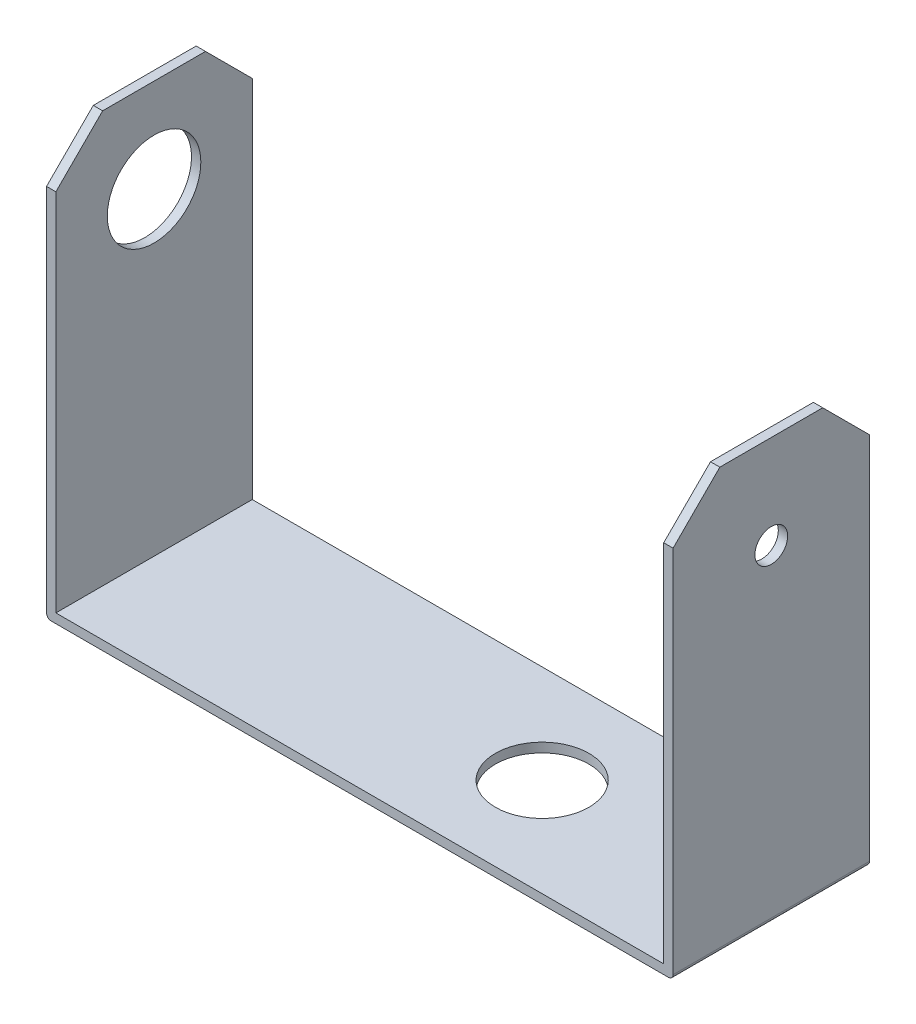
ISO-10303-21;
HEADER;
FILE_DESCRIPTION(('STEP AP214'),'2;1');
FILE_NAME('part.step','',(''),(''),'','','');
FILE_SCHEMA(('AUTOMOTIVE_DESIGN { 1 0 10303 214 1 1 1 1 }'));
ENDSEC;
DATA;
#1=APPLICATION_CONTEXT('core data for automotive mechanical design processes');
#2=APPLICATION_PROTOCOL_DEFINITION('international standard','automotive_design',2000,#1);
#3=PRODUCT_CONTEXT('',#1,'mechanical');
#4=PRODUCT('Part','Part','',(#3));
#5=PRODUCT_RELATED_PRODUCT_CATEGORY('part','',(#4));
#6=PRODUCT_DEFINITION_FORMATION('','',#4);
#7=PRODUCT_DEFINITION_CONTEXT('part definition',#1,'design');
#8=PRODUCT_DEFINITION('design','',#6,#7);
#9=PRODUCT_DEFINITION_SHAPE('','',#8);
#10=(LENGTH_UNIT() NAMED_UNIT(*) SI_UNIT(.MILLI.,.METRE.));
#11=(NAMED_UNIT(*) PLANE_ANGLE_UNIT() SI_UNIT($,.RADIAN.));
#12=(NAMED_UNIT(*) SI_UNIT($,.STERADIAN.) SOLID_ANGLE_UNIT());
#13=UNCERTAINTY_MEASURE_WITH_UNIT(LENGTH_MEASURE(1.E-05),#10,'distance_accuracy_value','');
#14=(GEOMETRIC_REPRESENTATION_CONTEXT(3) GLOBAL_UNCERTAINTY_ASSIGNED_CONTEXT((#13)) GLOBAL_UNIT_ASSIGNED_CONTEXT((#10,
#11,#12)) REPRESENTATION_CONTEXT('',''));
#15=CARTESIAN_POINT('',(0.,0.,0.));
#16=DIRECTION('',(0.,0.,1.));
#17=DIRECTION('',(1.,0.,0.));
#18=AXIS2_PLACEMENT_3D('',#15,#16,#17);
#19=CARTESIAN_POINT('',(0.,45.,-21.));
#20=DIRECTION('',(-1.,0.,0.));
#21=DIRECTION('',(0.,0.,1.));
#22=AXIS2_PLACEMENT_3D('',#19,#20,#21);
#23=PLANE('',#22);
#24=DIRECTION('',(0.,-1.,0.));
#25=VECTOR('',#24,1.);
#26=CARTESIAN_POINT('',(0.,45.,-21.));
#27=LINE('',#26,#25);
#28=CARTESIAN_POINT('',(0.,40.,-21.));
#29=VERTEX_POINT('',#28);
#30=CARTESIAN_POINT('',(0.,0.500000000000014,-21.));
#31=VERTEX_POINT('',#30);
#32=EDGE_CURVE('E194',#29,#31,#27,.T.);
#33=ORIENTED_EDGE('',*,*,#32,.F.);
#34=DIRECTION('',(0.,-0.707106781186547,-0.707106781186548));
#35=VECTOR('',#34,1.);
#36=CARTESIAN_POINT('',(0.,45.,-16.));
#37=LINE('',#36,#35);
#38=CARTESIAN_POINT('',(0.,45.,-16.));
#39=VERTEX_POINT('',#38);
#40=EDGE_CURVE('E11',#29,#39,#37,.F.);
#41=ORIENTED_EDGE('',*,*,#40,.T.);
#42=DIRECTION('',(0.,0.,-1.));
#43=VECTOR('',#42,1.);
#44=CARTESIAN_POINT('',(0.,45.,-21.));
#45=LINE('',#44,#43);
#46=CARTESIAN_POINT('',(0.,45.,-5.00000000000003));
#47=VERTEX_POINT('',#46);
#48=EDGE_CURVE('E178',#47,#39,#45,.T.);
#49=ORIENTED_EDGE('',*,*,#48,.F.);
#50=DIRECTION('',(0.,0.707106781186547,-0.707106781186548));
#51=VECTOR('',#50,1.);
#52=CARTESIAN_POINT('',(0.,45.,-5.00000000000003));
#53=LINE('',#52,#51);
#54=CARTESIAN_POINT('',(0.,40.,0.));
#55=VERTEX_POINT('',#54);
#56=EDGE_CURVE('E43',#47,#55,#53,.F.);
#57=ORIENTED_EDGE('',*,*,#56,.T.);
#58=DIRECTION('',(0.,-1.,0.));
#59=VECTOR('',#58,1.);
#60=CARTESIAN_POINT('',(0.,45.,0.));
#61=LINE('',#60,#59);
#62=CARTESIAN_POINT('',(0.,0.500000000000014,0.));
#63=VERTEX_POINT('',#62);
#64=EDGE_CURVE('E184',#55,#63,#61,.T.);
#65=ORIENTED_EDGE('',*,*,#64,.T.);
#66=DIRECTION('',(0.,0.,-1.));
#67=VECTOR('',#66,1.);
#68=CARTESIAN_POINT('',(0.,0.5,-21.));
#69=LINE('',#68,#67);
#70=EDGE_CURVE('E196',#63,#31,#69,.T.);
#71=ORIENTED_EDGE('',*,*,#70,.T.);
#72=EDGE_LOOP('',(#33,#41,#49,#57,#65,#71));
#73=FACE_BOUND('',#72,.T.);
#74=CARTESIAN_POINT('',(0.,35.,-10.5));
#75=DIRECTION('',(1.,0.,0.));
#76=DIRECTION('',(0.,0.,-1.));
#77=AXIS2_PLACEMENT_3D('',#74,#75,#76);
#78=CIRCLE('',#77,1.75);
#79=CARTESIAN_POINT('',(0.,35.,-12.25));
#80=VERTEX_POINT('',#79);
#81=EDGE_CURVE('E367',#80,#80,#78,.T.);
#82=ORIENTED_EDGE('',*,*,#81,.F.);
#83=EDGE_LOOP('',(#82));
#84=FACE_BOUND('',#83,.T.);
#85=ADVANCED_FACE('F35',(#73,#84),#23,.F.);
#86=CARTESIAN_POINT('',(0.,45.,0.));
#87=DIRECTION('',(0.,-1.,0.));
#88=DIRECTION('',(0.,0.,-1.));
#89=AXIS2_PLACEMENT_3D('',#86,#87,#88);
#90=PLANE('',#89);
#91=ORIENTED_EDGE('',*,*,#48,.T.);
#92=DIRECTION('',(-1.,0.,0.));
#93=VECTOR('',#92,1.);
#94=CARTESIAN_POINT('',(0.,45.,-16.));
#95=LINE('',#94,#93);
#96=CARTESIAN_POINT('',(-1.,45.,-16.));
#97=VERTEX_POINT('',#96);
#98=EDGE_CURVE('E240',#39,#97,#95,.T.);
#99=ORIENTED_EDGE('',*,*,#98,.T.);
#100=DIRECTION('',(0.,0.,-1.));
#101=VECTOR('',#100,1.);
#102=CARTESIAN_POINT('',(-1.,45.,0.));
#103=LINE('',#102,#101);
#104=CARTESIAN_POINT('',(-1.,45.,-5.00000000000003));
#105=VERTEX_POINT('',#104);
#106=EDGE_CURVE('E173',#105,#97,#103,.T.);
#107=ORIENTED_EDGE('',*,*,#106,.F.);
#108=DIRECTION('',(1.,0.,0.));
#109=VECTOR('',#108,1.);
#110=CARTESIAN_POINT('',(0.,45.,-5.00000000000003));
#111=LINE('',#110,#109);
#112=EDGE_CURVE('E238',#105,#47,#111,.T.);
#113=ORIENTED_EDGE('',*,*,#112,.T.);
#114=EDGE_LOOP('',(#91,#99,#107,#113));
#115=FACE_BOUND('',#114,.T.);
#116=ADVANCED_FACE('F255',(#115),#90,.F.);
#117=DIRECTION('',(0.,0.,1.));
#118=VECTOR('',#117,1.);
#119=CARTESIAN_POINT('',(-66.,45.,0.));
#120=LINE('',#119,#118);
#121=CARTESIAN_POINT('',(-66.,45.,-16.));
#122=VERTEX_POINT('',#121);
#123=CARTESIAN_POINT('',(-66.,45.,-5.00000000000003));
#124=VERTEX_POINT('',#123);
#125=EDGE_CURVE('E169',#122,#124,#120,.T.);
#126=ORIENTED_EDGE('',*,*,#125,.F.);
#127=DIRECTION('',(-1.,0.,0.));
#128=VECTOR('',#127,1.);
#129=CARTESIAN_POINT('',(0.,45.,-16.));
#130=LINE('',#129,#128);
#131=CARTESIAN_POINT('',(-67.,45.,-16.));
#132=VERTEX_POINT('',#131);
#133=EDGE_CURVE('E219',#122,#132,#130,.T.);
#134=ORIENTED_EDGE('',*,*,#133,.T.);
#135=DIRECTION('',(0.,0.,1.));
#136=VECTOR('',#135,1.);
#137=CARTESIAN_POINT('',(-67.,45.,0.));
#138=LINE('',#137,#136);
#139=CARTESIAN_POINT('',(-67.,45.,-5.00000000000003));
#140=VERTEX_POINT('',#139);
#141=EDGE_CURVE('E180',#132,#140,#138,.T.);
#142=ORIENTED_EDGE('',*,*,#141,.T.);
#143=DIRECTION('',(1.,0.,0.));
#144=VECTOR('',#143,1.);
#145=CARTESIAN_POINT('',(0.,45.,-5.00000000000003));
#146=LINE('',#145,#144);
#147=EDGE_CURVE('E216',#140,#124,#146,.T.);
#148=ORIENTED_EDGE('',*,*,#147,.T.);
#149=EDGE_LOOP('',(#126,#134,#142,#148));
#150=FACE_BOUND('',#149,.T.);
#151=ADVANCED_FACE('F283',(#150),#90,.F.);
#152=CARTESIAN_POINT('',(-67.,45.,-21.));
#153=DIRECTION('',(0.,0.,1.));
#154=DIRECTION('',(1.,0.,0.));
#155=AXIS2_PLACEMENT_3D('',#152,#153,#154);
#156=PLANE('',#155);
#157=DIRECTION('',(0.,-1.,0.));
#158=VECTOR('',#157,1.);
#159=CARTESIAN_POINT('',(-67.,45.,-21.));
#160=LINE('',#159,#158);
#161=CARTESIAN_POINT('',(-67.,40.,-21.));
#162=VERTEX_POINT('',#161);
#163=CARTESIAN_POINT('',(-67.,0.500000000000014,-21.));
#164=VERTEX_POINT('',#163);
#165=EDGE_CURVE('E192',#162,#164,#160,.T.);
#166=ORIENTED_EDGE('',*,*,#165,.F.);
#167=DIRECTION('',(1.,0.,0.));
#168=VECTOR('',#167,1.);
#169=CARTESIAN_POINT('',(-67.,40.,-21.));
#170=LINE('',#169,#168);
#171=CARTESIAN_POINT('',(-66.,40.,-21.));
#172=VERTEX_POINT('',#171);
#173=EDGE_CURVE('E228',#162,#172,#170,.T.);
#174=ORIENTED_EDGE('',*,*,#173,.T.);
#175=DIRECTION('',(0.,-1.,0.));
#176=VECTOR('',#175,1.);
#177=CARTESIAN_POINT('',(-66.,45.,-21.));
#178=LINE('',#177,#176);
#179=CARTESIAN_POINT('',(-66.,1.,-21.));
#180=VERTEX_POINT('',#179);
#181=EDGE_CURVE('E147',#172,#180,#178,.T.);
#182=ORIENTED_EDGE('',*,*,#181,.T.);
#183=DIRECTION('',(-1.,0.,0.));
#184=VECTOR('',#183,1.);
#185=CARTESIAN_POINT('',(0.,1.,-21.));
#186=LINE('',#185,#184);
#187=CARTESIAN_POINT('',(-1.,1.,-21.));
#188=VERTEX_POINT('',#187);
#189=EDGE_CURVE('E154',#188,#180,#186,.T.);
#190=ORIENTED_EDGE('',*,*,#189,.F.);
#191=DIRECTION('',(0.,-1.,0.));
#192=VECTOR('',#191,1.);
#193=CARTESIAN_POINT('',(-1.00000000000001,45.,-21.));
#194=LINE('',#193,#192);
#195=CARTESIAN_POINT('',(-1.00000000000001,40.,-21.));
#196=VERTEX_POINT('',#195);
#197=EDGE_CURVE('E136',#196,#188,#194,.T.);
#198=ORIENTED_EDGE('',*,*,#197,.F.);
#199=DIRECTION('',(1.,0.,0.));
#200=VECTOR('',#199,1.);
#201=CARTESIAN_POINT('',(-67.,40.,-21.));
#202=LINE('',#201,#200);
#203=EDGE_CURVE('E226',#196,#29,#202,.T.);
#204=ORIENTED_EDGE('',*,*,#203,.T.);
#205=ORIENTED_EDGE('',*,*,#32,.T.);
#206=CARTESIAN_POINT('',(-0.5,0.5,-21.));
#207=DIRECTION('',(0.,0.,1.));
#208=DIRECTION('',(1.,0.,0.));
#209=AXIS2_PLACEMENT_3D('',#206,#207,#208);
#210=CIRCLE('',#209,0.5);
#211=CARTESIAN_POINT('',(-0.5,0.,-21.));
#212=VERTEX_POINT('',#211);
#213=EDGE_CURVE('E202',#31,#212,#210,.F.);
#214=ORIENTED_EDGE('',*,*,#213,.T.);
#215=DIRECTION('',(-1.,0.,0.));
#216=VECTOR('',#215,1.);
#217=CARTESIAN_POINT('',(-67.,0.,-21.));
#218=LINE('',#217,#216);
#219=CARTESIAN_POINT('',(-66.5,0.,-21.));
#220=VERTEX_POINT('',#219);
#221=EDGE_CURVE('E146',#212,#220,#218,.T.);
#222=ORIENTED_EDGE('',*,*,#221,.T.);
#223=CARTESIAN_POINT('',(-66.5,0.5,-21.));
#224=DIRECTION('',(0.,0.,1.));
#225=DIRECTION('',(1.,0.,0.));
#226=AXIS2_PLACEMENT_3D('',#223,#224,#225);
#227=CIRCLE('',#226,0.5);
#228=EDGE_CURVE('E199',#220,#164,#227,.F.);
#229=ORIENTED_EDGE('',*,*,#228,.T.);
#230=EDGE_LOOP('',(#166,#174,#182,#190,#198,#204,#205,#214,#222,#229));
#231=FACE_BOUND('',#230,.T.);
#232=ADVANCED_FACE('F161',(#231),#156,.F.);
#233=CARTESIAN_POINT('',(-67.,45.,0.));
#234=DIRECTION('',(1.,0.,0.));
#235=DIRECTION('',(0.,0.,-1.));
#236=AXIS2_PLACEMENT_3D('',#233,#234,#235);
#237=PLANE('',#236);
#238=CARTESIAN_POINT('',(-67.,35.,-10.5));
#239=DIRECTION('',(-1.,0.,0.));
#240=DIRECTION('',(0.,0.,1.));
#241=AXIS2_PLACEMENT_3D('',#238,#239,#240);
#242=CIRCLE('',#241,4.99999999999999);
#243=CARTESIAN_POINT('',(-67.,35.,-5.50000000000001));
#244=VERTEX_POINT('',#243);
#245=EDGE_CURVE('E354',#244,#244,#242,.T.);
#246=ORIENTED_EDGE('',*,*,#245,.F.);
#247=EDGE_LOOP('',(#246));
#248=FACE_BOUND('',#247,.T.);
#249=ORIENTED_EDGE('',*,*,#141,.F.);
#250=DIRECTION('',(0.,0.707106781186547,0.707106781186548));
#251=VECTOR('',#250,1.);
#252=CARTESIAN_POINT('',(-67.,45.,-16.));
#253=LINE('',#252,#251);
#254=EDGE_CURVE('E224',#132,#162,#253,.F.);
#255=ORIENTED_EDGE('',*,*,#254,.T.);
#256=ORIENTED_EDGE('',*,*,#165,.T.);
#257=DIRECTION('',(0.,0.,1.));
#258=VECTOR('',#257,1.);
#259=CARTESIAN_POINT('',(-67.,0.5,0.));
#260=LINE('',#259,#258);
#261=CARTESIAN_POINT('',(-67.,0.500000000000014,0.));
#262=VERTEX_POINT('',#261);
#263=EDGE_CURVE('E213',#164,#262,#260,.T.);
#264=ORIENTED_EDGE('',*,*,#263,.T.);
#265=DIRECTION('',(0.,-1.,0.));
#266=VECTOR('',#265,1.);
#267=CARTESIAN_POINT('',(-67.,45.,0.));
#268=LINE('',#267,#266);
#269=CARTESIAN_POINT('',(-67.,40.,0.));
#270=VERTEX_POINT('',#269);
#271=EDGE_CURVE('E190',#270,#262,#268,.T.);
#272=ORIENTED_EDGE('',*,*,#271,.F.);
#273=DIRECTION('',(0.,-0.707106781186547,0.707106781186548));
#274=VECTOR('',#273,1.);
#275=CARTESIAN_POINT('',(-67.,45.,-5.00000000000003));
#276=LINE('',#275,#274);
#277=EDGE_CURVE('E222',#270,#140,#276,.F.);
#278=ORIENTED_EDGE('',*,*,#277,.T.);
#279=EDGE_LOOP('',(#249,#255,#256,#264,#272,#278));
#280=FACE_BOUND('',#279,.T.);
#281=ADVANCED_FACE('F291',(#248,#280),#237,.F.);
#282=CARTESIAN_POINT('',(0.,45.,0.));
#283=DIRECTION('',(0.,0.,-1.));
#284=DIRECTION('',(-1.,0.,0.));
#285=AXIS2_PLACEMENT_3D('',#282,#283,#284);
#286=PLANE('',#285);
#287=DIRECTION('',(0.,-1.,0.));
#288=VECTOR('',#287,1.);
#289=CARTESIAN_POINT('',(-66.,45.,0.));
#290=LINE('',#289,#288);
#291=CARTESIAN_POINT('',(-66.,40.,0.));
#292=VERTEX_POINT('',#291);
#293=CARTESIAN_POINT('',(-66.,1.,0.));
#294=VERTEX_POINT('',#293);
#295=EDGE_CURVE('E168',#292,#294,#290,.T.);
#296=ORIENTED_EDGE('',*,*,#295,.F.);
#297=DIRECTION('',(-1.,0.,0.));
#298=VECTOR('',#297,1.);
#299=CARTESIAN_POINT('',(0.,40.,0.));
#300=LINE('',#299,#298);
#301=EDGE_CURVE('E236',#292,#270,#300,.T.);
#302=ORIENTED_EDGE('',*,*,#301,.T.);
#303=ORIENTED_EDGE('',*,*,#271,.T.);
#304=CARTESIAN_POINT('',(-66.5,0.5,0.));
#305=DIRECTION('',(0.,0.,-1.));
#306=DIRECTION('',(-1.,0.,0.));
#307=AXIS2_PLACEMENT_3D('',#304,#305,#306);
#308=CIRCLE('',#307,0.5);
#309=CARTESIAN_POINT('',(-66.5,0.,0.));
#310=VERTEX_POINT('',#309);
#311=EDGE_CURVE('E208',#262,#310,#308,.F.);
#312=ORIENTED_EDGE('',*,*,#311,.T.);
#313=DIRECTION('',(1.,0.,0.));
#314=VECTOR('',#313,1.);
#315=CARTESIAN_POINT('',(0.,0.,0.));
#316=LINE('',#315,#314);
#317=CARTESIAN_POINT('',(-0.5,0.,0.));
#318=VERTEX_POINT('',#317);
#319=EDGE_CURVE('E181',#310,#318,#316,.T.);
#320=ORIENTED_EDGE('',*,*,#319,.T.);
#321=CARTESIAN_POINT('',(-0.5,0.5,0.));
#322=DIRECTION('',(0.,0.,-1.));
#323=DIRECTION('',(-1.,0.,0.));
#324=AXIS2_PLACEMENT_3D('',#321,#322,#323);
#325=CIRCLE('',#324,0.5);
#326=EDGE_CURVE('E210',#318,#63,#325,.F.);
#327=ORIENTED_EDGE('',*,*,#326,.T.);
#328=ORIENTED_EDGE('',*,*,#64,.F.);
#329=DIRECTION('',(-1.,0.,0.));
#330=VECTOR('',#329,1.);
#331=CARTESIAN_POINT('',(0.,40.,0.));
#332=LINE('',#331,#330);
#333=CARTESIAN_POINT('',(-1.,40.,0.));
#334=VERTEX_POINT('',#333);
#335=EDGE_CURVE('E234',#55,#334,#332,.T.);
#336=ORIENTED_EDGE('',*,*,#335,.T.);
#337=DIRECTION('',(0.,-1.,0.));
#338=VECTOR('',#337,1.);
#339=CARTESIAN_POINT('',(-1.,45.,0.));
#340=LINE('',#339,#338);
#341=CARTESIAN_POINT('',(-1.,1.,0.));
#342=VERTEX_POINT('',#341);
#343=EDGE_CURVE('E172',#334,#342,#340,.T.);
#344=ORIENTED_EDGE('',*,*,#343,.T.);
#345=DIRECTION('',(1.,0.,0.));
#346=VECTOR('',#345,1.);
#347=CARTESIAN_POINT('',(0.,1.,0.));
#348=LINE('',#347,#346);
#349=EDGE_CURVE('E157',#294,#342,#348,.T.);
#350=ORIENTED_EDGE('',*,*,#349,.F.);
#351=EDGE_LOOP('',(#296,#302,#303,#312,#320,#327,#328,#336,#344,#350));
#352=FACE_BOUND('',#351,.T.);
#353=ADVANCED_FACE('F249',(#352),#286,.F.);
#354=CARTESIAN_POINT('',(0.,0.,0.));
#355=DIRECTION('',(0.,-1.,0.));
#356=DIRECTION('',(0.,0.,-1.));
#357=AXIS2_PLACEMENT_3D('',#354,#355,#356);
#358=PLANE('',#357);
#359=CARTESIAN_POINT('',(-24.5,0.,-10.5));
#360=DIRECTION('',(0.,-1.,0.));
#361=DIRECTION('',(0.,0.,-1.));
#362=AXIS2_PLACEMENT_3D('',#359,#360,#361);
#363=CIRCLE('',#362,4.99999999999999);
#364=CARTESIAN_POINT('',(-24.5,0.,-15.5));
#365=VERTEX_POINT('',#364);
#366=EDGE_CURVE('E352',#365,#365,#363,.T.);
#367=ORIENTED_EDGE('',*,*,#366,.F.);
#368=EDGE_LOOP('',(#367));
#369=FACE_BOUND('',#368,.T.);
#370=ORIENTED_EDGE('',*,*,#221,.F.);
#371=DIRECTION('',(0.,0.,-1.));
#372=VECTOR('',#371,1.);
#373=CARTESIAN_POINT('',(-0.5,0.,0.));
#374=LINE('',#373,#372);
#375=EDGE_CURVE('E206',#212,#318,#374,.F.);
#376=ORIENTED_EDGE('',*,*,#375,.T.);
#377=ORIENTED_EDGE('',*,*,#319,.F.);
#378=DIRECTION('',(0.,0.,1.));
#379=VECTOR('',#378,1.);
#380=CARTESIAN_POINT('',(-66.5,0.,-21.));
#381=LINE('',#380,#379);
#382=EDGE_CURVE('E204',#310,#220,#381,.F.);
#383=ORIENTED_EDGE('',*,*,#382,.T.);
#384=EDGE_LOOP('',(#370,#376,#377,#383));
#385=FACE_BOUND('',#384,.T.);
#386=ADVANCED_FACE('F266',(#369,#385),#358,.T.);
#387=CARTESIAN_POINT('',(-1.,45.,-21.));
#388=DIRECTION('',(-1.,0.,0.));
#389=DIRECTION('',(0.,0.,1.));
#390=AXIS2_PLACEMENT_3D('',#387,#388,#389);
#391=PLANE('',#390);
#392=CARTESIAN_POINT('',(-1.,35.,-10.5));
#393=DIRECTION('',(-1.,0.,0.));
#394=DIRECTION('',(0.,0.,1.));
#395=AXIS2_PLACEMENT_3D('',#392,#393,#394);
#396=CIRCLE('',#395,1.75);
#397=CARTESIAN_POINT('',(-1.,35.,-8.75));
#398=VERTEX_POINT('',#397);
#399=EDGE_CURVE('E359',#398,#398,#396,.T.);
#400=ORIENTED_EDGE('',*,*,#399,.F.);
#401=EDGE_LOOP('',(#400));
#402=FACE_BOUND('',#401,.T.);
#403=ORIENTED_EDGE('',*,*,#106,.T.);
#404=DIRECTION('',(0.,0.707106781186547,0.707106781186548));
#405=VECTOR('',#404,1.);
#406=CARTESIAN_POINT('',(-1.,42.5,-18.5));
#407=LINE('',#406,#405);
#408=EDGE_CURVE('E142',#97,#196,#407,.F.);
#409=ORIENTED_EDGE('',*,*,#408,.T.);
#410=ORIENTED_EDGE('',*,*,#197,.T.);
#411=DIRECTION('',(0.,0.,-1.));
#412=VECTOR('',#411,1.);
#413=CARTESIAN_POINT('',(-1.,1.,0.));
#414=LINE('',#413,#412);
#415=EDGE_CURVE('E141',#342,#188,#414,.T.);
#416=ORIENTED_EDGE('',*,*,#415,.F.);
#417=ORIENTED_EDGE('',*,*,#343,.F.);
#418=DIRECTION('',(0.,-0.707106781186547,0.707106781186548));
#419=VECTOR('',#418,1.);
#420=CARTESIAN_POINT('',(-1.,53.,-13.));
#421=LINE('',#420,#419);
#422=EDGE_CURVE('E243',#334,#105,#421,.F.);
#423=ORIENTED_EDGE('',*,*,#422,.T.);
#424=EDGE_LOOP('',(#403,#409,#410,#416,#417,#423));
#425=FACE_BOUND('',#424,.T.);
#426=ADVANCED_FACE('F139',(#402,#425),#391,.T.);
#427=CARTESIAN_POINT('',(-66.,45.,0.));
#428=DIRECTION('',(1.,0.,0.));
#429=DIRECTION('',(0.,0.,-1.));
#430=AXIS2_PLACEMENT_3D('',#427,#428,#429);
#431=PLANE('',#430);
#432=CARTESIAN_POINT('',(-66.,35.,-10.5));
#433=DIRECTION('',(1.,0.,0.));
#434=DIRECTION('',(0.,0.,-1.));
#435=AXIS2_PLACEMENT_3D('',#432,#433,#434);
#436=CIRCLE('',#435,4.99999999999999);
#437=CARTESIAN_POINT('',(-66.,35.,-15.5));
#438=VERTEX_POINT('',#437);
#439=EDGE_CURVE('E158',#438,#438,#436,.T.);
#440=ORIENTED_EDGE('',*,*,#439,.F.);
#441=EDGE_LOOP('',(#440));
#442=FACE_BOUND('',#441,.T.);
#443=ORIENTED_EDGE('',*,*,#181,.F.);
#444=DIRECTION('',(0.,-0.707106781186547,-0.707106781186548));
#445=VECTOR('',#444,1.);
#446=CARTESIAN_POINT('',(-66.,53.,-7.99999999999997));
#447=LINE('',#446,#445);
#448=EDGE_CURVE('E232',#172,#122,#447,.F.);
#449=ORIENTED_EDGE('',*,*,#448,.T.);
#450=ORIENTED_EDGE('',*,*,#125,.T.);
#451=DIRECTION('',(0.,0.707106781186547,-0.707106781186548));
#452=VECTOR('',#451,1.);
#453=CARTESIAN_POINT('',(-66.,42.5,-2.50000000000001));
#454=LINE('',#453,#452);
#455=EDGE_CURVE('E230',#124,#292,#454,.F.);
#456=ORIENTED_EDGE('',*,*,#455,.T.);
#457=ORIENTED_EDGE('',*,*,#295,.T.);
#458=DIRECTION('',(0.,0.,1.));
#459=VECTOR('',#458,1.);
#460=CARTESIAN_POINT('',(-66.,1.,0.));
#461=LINE('',#460,#459);
#462=EDGE_CURVE('E163',#180,#294,#461,.T.);
#463=ORIENTED_EDGE('',*,*,#462,.F.);
#464=EDGE_LOOP('',(#443,#449,#450,#456,#457,#463));
#465=FACE_BOUND('',#464,.T.);
#466=ADVANCED_FACE('F281',(#442,#465),#431,.T.);
#467=CARTESIAN_POINT('',(0.,1.,0.));
#468=DIRECTION('',(0.,-1.,0.));
#469=DIRECTION('',(0.,0.,-1.));
#470=AXIS2_PLACEMENT_3D('',#467,#468,#469);
#471=PLANE('',#470);
#472=CARTESIAN_POINT('',(-24.5,1.,-10.5));
#473=DIRECTION('',(0.,1.,0.));
#474=DIRECTION('',(0.,0.,1.));
#475=AXIS2_PLACEMENT_3D('',#472,#473,#474);
#476=CIRCLE('',#475,4.99999999999999);
#477=CARTESIAN_POINT('',(-24.5,1.,-5.50000000000001));
#478=VERTEX_POINT('',#477);
#479=EDGE_CURVE('E355',#478,#478,#476,.T.);
#480=ORIENTED_EDGE('',*,*,#479,.F.);
#481=EDGE_LOOP('',(#480));
#482=FACE_BOUND('',#481,.T.);
#483=ORIENTED_EDGE('',*,*,#415,.T.);
#484=ORIENTED_EDGE('',*,*,#189,.T.);
#485=ORIENTED_EDGE('',*,*,#462,.T.);
#486=ORIENTED_EDGE('',*,*,#349,.T.);
#487=EDGE_LOOP('',(#483,#484,#485,#486));
#488=FACE_BOUND('',#487,.T.);
#489=ADVANCED_FACE('F152',(#482,#488),#471,.F.);
#490=CARTESIAN_POINT('',(-0.5,0.5,-21.));
#491=DIRECTION('',(0.,0.,1.));
#492=DIRECTION('',(1.,0.,0.));
#493=AXIS2_PLACEMENT_3D('',#490,#491,#492);
#494=CYLINDRICAL_SURFACE('',#493,0.5);
#495=ORIENTED_EDGE('',*,*,#326,.F.);
#496=ORIENTED_EDGE('',*,*,#375,.F.);
#497=ORIENTED_EDGE('',*,*,#213,.F.);
#498=ORIENTED_EDGE('',*,*,#70,.F.);
#499=EDGE_LOOP('',(#495,#496,#497,#498));
#500=FACE_BOUND('',#499,.T.);
#501=ADVANCED_FACE('F261',(#500),#494,.T.);
#502=CARTESIAN_POINT('',(-66.5,0.5,0.));
#503=DIRECTION('',(0.,0.,-1.));
#504=DIRECTION('',(-1.,0.,0.));
#505=AXIS2_PLACEMENT_3D('',#502,#503,#504);
#506=CYLINDRICAL_SURFACE('',#505,0.5);
#507=ORIENTED_EDGE('',*,*,#228,.F.);
#508=ORIENTED_EDGE('',*,*,#382,.F.);
#509=ORIENTED_EDGE('',*,*,#311,.F.);
#510=ORIENTED_EDGE('',*,*,#263,.F.);
#511=EDGE_LOOP('',(#507,#508,#509,#510));
#512=FACE_BOUND('',#511,.T.);
#513=ADVANCED_FACE('F271',(#512),#506,.T.);
#514=CARTESIAN_POINT('',(0.,45.,-16.));
#515=DIRECTION('',(0.,-0.707106781186548,0.707106781186547));
#516=DIRECTION('',(-1.,0.,0.));
#517=AXIS2_PLACEMENT_3D('',#514,#515,#516);
#518=PLANE('',#517);
#519=ORIENTED_EDGE('',*,*,#448,.F.);
#520=ORIENTED_EDGE('',*,*,#173,.F.);
#521=ORIENTED_EDGE('',*,*,#254,.F.);
#522=ORIENTED_EDGE('',*,*,#133,.F.);
#523=EDGE_LOOP('',(#519,#520,#521,#522));
#524=FACE_BOUND('',#523,.T.);
#525=ADVANCED_FACE('F277',(#524),#518,.F.);
#526=CARTESIAN_POINT('',(0.,45.,-5.00000000000003));
#527=DIRECTION('',(0.,-0.707106781186548,-0.707106781186547));
#528=DIRECTION('',(1.,0.,0.));
#529=AXIS2_PLACEMENT_3D('',#526,#527,#528);
#530=PLANE('',#529);
#531=ORIENTED_EDGE('',*,*,#277,.F.);
#532=ORIENTED_EDGE('',*,*,#301,.F.);
#533=ORIENTED_EDGE('',*,*,#455,.F.);
#534=ORIENTED_EDGE('',*,*,#147,.F.);
#535=EDGE_LOOP('',(#531,#532,#533,#534));
#536=FACE_BOUND('',#535,.T.);
#537=ADVANCED_FACE('F288',(#536),#530,.F.);
#538=CARTESIAN_POINT('',(0.,45.,-16.));
#539=DIRECTION('',(0.,-0.707106781186548,0.707106781186547));
#540=DIRECTION('',(-1.,0.,0.));
#541=AXIS2_PLACEMENT_3D('',#538,#539,#540);
#542=PLANE('',#541);
#543=ORIENTED_EDGE('',*,*,#40,.F.);
#544=ORIENTED_EDGE('',*,*,#203,.F.);
#545=ORIENTED_EDGE('',*,*,#408,.F.);
#546=ORIENTED_EDGE('',*,*,#98,.F.);
#547=EDGE_LOOP('',(#543,#544,#545,#546));
#548=FACE_BOUND('',#547,.T.);
#549=ADVANCED_FACE('F258',(#548),#542,.F.);
#550=CARTESIAN_POINT('',(0.,45.,-5.00000000000003));
#551=DIRECTION('',(0.,-0.707106781186548,-0.707106781186547));
#552=DIRECTION('',(1.,0.,0.));
#553=AXIS2_PLACEMENT_3D('',#550,#551,#552);
#554=PLANE('',#553);
#555=ORIENTED_EDGE('',*,*,#422,.F.);
#556=ORIENTED_EDGE('',*,*,#335,.F.);
#557=ORIENTED_EDGE('',*,*,#56,.F.);
#558=ORIENTED_EDGE('',*,*,#112,.F.);
#559=EDGE_LOOP('',(#555,#556,#557,#558));
#560=FACE_BOUND('',#559,.T.);
#561=ADVANCED_FACE('F37',(#560),#554,.F.);
#562=CARTESIAN_POINT('',(-67.,35.,-10.5));
#563=DIRECTION('',(-1.,0.,0.));
#564=DIRECTION('',(0.,0.,1.));
#565=AXIS2_PLACEMENT_3D('',#562,#563,#564);
#566=CYLINDRICAL_SURFACE('',#565,4.99999999999999);
#567=ORIENTED_EDGE('',*,*,#245,.T.);
#568=EDGE_LOOP('',(#567));
#569=FACE_BOUND('',#568,.T.);
#570=ORIENTED_EDGE('',*,*,#439,.T.);
#571=EDGE_LOOP('',(#570));
#572=FACE_BOUND('',#571,.T.);
#573=ADVANCED_FACE('F320',(#569,#572),#566,.F.);
#574=CARTESIAN_POINT('',(-24.5,1.,-10.5));
#575=DIRECTION('',(0.,1.,0.));
#576=DIRECTION('',(0.,0.,1.));
#577=AXIS2_PLACEMENT_3D('',#574,#575,#576);
#578=CYLINDRICAL_SURFACE('',#577,4.99999999999999);
#579=ORIENTED_EDGE('',*,*,#479,.T.);
#580=EDGE_LOOP('',(#579));
#581=FACE_BOUND('',#580,.T.);
#582=ORIENTED_EDGE('',*,*,#366,.T.);
#583=EDGE_LOOP('',(#582));
#584=FACE_BOUND('',#583,.T.);
#585=ADVANCED_FACE('F324',(#581,#584),#578,.F.);
#586=CARTESIAN_POINT('',(0.,35.,-10.5));
#587=DIRECTION('',(1.,0.,0.));
#588=DIRECTION('',(0.,0.,-1.));
#589=AXIS2_PLACEMENT_3D('',#586,#587,#588);
#590=CYLINDRICAL_SURFACE('',#589,1.75);
#591=ORIENTED_EDGE('',*,*,#81,.T.);
#592=EDGE_LOOP('',(#591));
#593=FACE_BOUND('',#592,.T.);
#594=ORIENTED_EDGE('',*,*,#399,.T.);
#595=EDGE_LOOP('',(#594));
#596=FACE_BOUND('',#595,.T.);
#597=ADVANCED_FACE('F330',(#593,#596),#590,.F.);
#598=CLOSED_SHELL('',(#85,#116,#151,#232,#281,#353,#386,#426,#466,#489,#501,#513,#525,#537,#549,
#561,#573,#585,#597));
#599=MANIFOLD_SOLID_BREP('B2',#598);
#600=ADVANCED_BREP_SHAPE_REPRESENTATION('',(#18,#599),#14);
#601=SHAPE_DEFINITION_REPRESENTATION(#9,#600);
ENDSEC;
END-ISO-10303-21;
